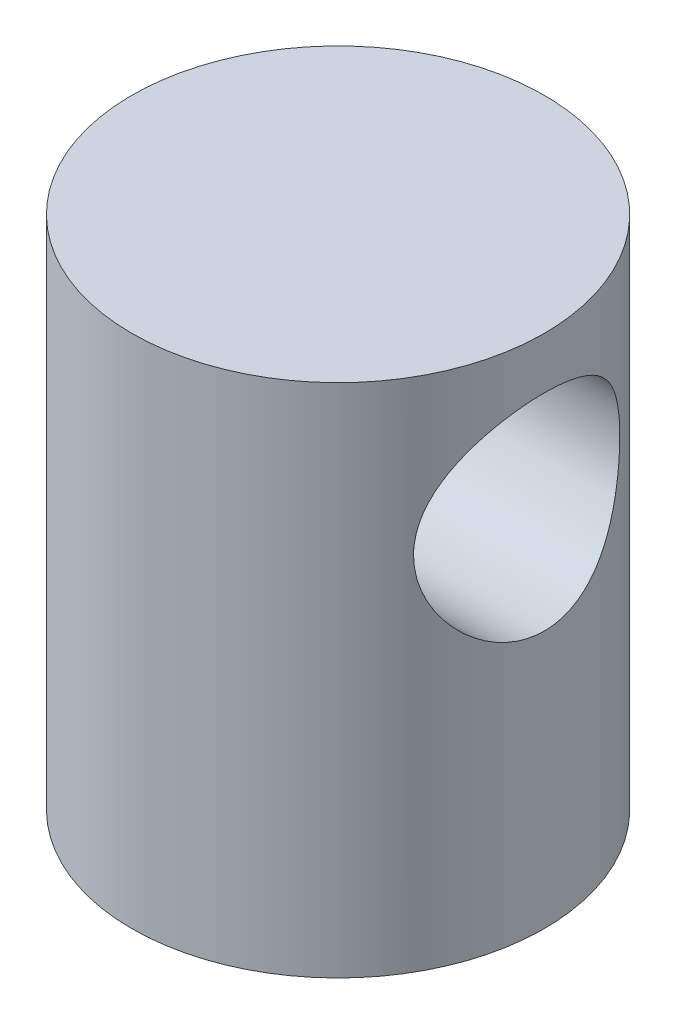
ISO-10303-21;
HEADER;
FILE_DESCRIPTION(('STEP AP214'),'2;1');
FILE_NAME('part.step','',(''),(''),'','','');
FILE_SCHEMA(('AUTOMOTIVE_DESIGN { 1 0 10303 214 1 1 1 1 }'));
ENDSEC;
DATA;
#1=APPLICATION_CONTEXT('core data for automotive mechanical design processes');
#2=APPLICATION_PROTOCOL_DEFINITION('international standard','automotive_design',2000,#1);
#3=PRODUCT_CONTEXT('',#1,'mechanical');
#4=PRODUCT('Part','Part','',(#3));
#5=PRODUCT_RELATED_PRODUCT_CATEGORY('part','',(#4));
#6=PRODUCT_DEFINITION_FORMATION('','',#4);
#7=PRODUCT_DEFINITION_CONTEXT('part definition',#1,'design');
#8=PRODUCT_DEFINITION('design','',#6,#7);
#9=PRODUCT_DEFINITION_SHAPE('','',#8);
#10=(LENGTH_UNIT() NAMED_UNIT(*) SI_UNIT(.MILLI.,.METRE.));
#11=(NAMED_UNIT(*) PLANE_ANGLE_UNIT() SI_UNIT($,.RADIAN.));
#12=(NAMED_UNIT(*) SI_UNIT($,.STERADIAN.) SOLID_ANGLE_UNIT());
#13=UNCERTAINTY_MEASURE_WITH_UNIT(LENGTH_MEASURE(1.E-05),#10,'distance_accuracy_value','');
#14=(GEOMETRIC_REPRESENTATION_CONTEXT(3) GLOBAL_UNCERTAINTY_ASSIGNED_CONTEXT((#13)) GLOBAL_UNIT_ASSIGNED_CONTEXT((#10,
#11,#12)) REPRESENTATION_CONTEXT('',''));
#15=CARTESIAN_POINT('',(0.,0.,0.));
#16=DIRECTION('',(0.,0.,1.));
#17=DIRECTION('',(1.,0.,0.));
#18=AXIS2_PLACEMENT_3D('',#15,#16,#17);
#19=CARTESIAN_POINT('',(0.,50.,0.));
#20=DIRECTION('',(0.,-1.,0.));
#21=DIRECTION('',(0.,0.,-1.));
#22=AXIS2_PLACEMENT_3D('',#19,#20,#21);
#23=CYLINDRICAL_SURFACE('',#22,20.);
#24=CARTESIAN_POINT('',(0.,50.,0.));
#25=DIRECTION('',(0.,1.,0.));
#26=DIRECTION('',(0.,0.,1.));
#27=AXIS2_PLACEMENT_3D('',#24,#25,#26);
#28=CIRCLE('',#27,20.);
#29=CARTESIAN_POINT('',(0.,50.,20.));
#30=VERTEX_POINT('',#29);
#31=EDGE_CURVE('E10',#30,#30,#28,.T.);
#32=ORIENTED_EDGE('',*,*,#31,.F.);
#33=EDGE_LOOP('',(#32));
#34=FACE_BOUND('',#33,.T.);
#35=CARTESIAN_POINT('',(0.,0.,0.));
#36=DIRECTION('',(0.,1.,0.));
#37=DIRECTION('',(0.,0.,1.));
#38=AXIS2_PLACEMENT_3D('',#35,#36,#37);
#39=CIRCLE('',#38,20.);
#40=CARTESIAN_POINT('',(0.,0.,20.));
#41=VERTEX_POINT('',#40);
#42=EDGE_CURVE('E46',#41,#41,#39,.T.);
#43=ORIENTED_EDGE('',*,*,#42,.T.);
#44=EDGE_LOOP('',(#43));
#45=FACE_BOUND('',#44,.T.);
#46=CARTESIAN_POINT('',(-17.3205080756888,35.,10.));
#47=CARTESIAN_POINT('',(-17.3205095702683,35.2606630406012,9.99999887830497));
#48=CARTESIAN_POINT('',(-17.3264124109147,35.5213487765781,9.98979463038363));
#49=CARTESIAN_POINT('',(-17.3498046872689,36.0407114771056,9.94911125215874));
#50=CARTESIAN_POINT('',(-17.3672995171185,36.2993874497232,9.91862268285217));
#51=CARTESIAN_POINT('',(-17.4132568469047,36.8130233814932,9.83771551508561));
#52=CARTESIAN_POINT('',(-17.4417365535713,37.0679768561899,9.78726564599456));
#53=CARTESIAN_POINT('',(-17.5086546907093,37.5720498819736,9.66704369384918));
#54=CARTESIAN_POINT('',(-17.5470974356035,37.821166854517,9.59726323891774));
#55=CARTESIAN_POINT('',(-17.6323996319525,38.310473680887,9.43962165537102));
#56=CARTESIAN_POINT('',(-17.6792090659448,38.5507068685627,9.3518675445998));
#57=CARTESIAN_POINT('',(-17.779982741108,39.0225542268414,9.15882440342409));
#58=CARTESIAN_POINT('',(-17.8339495753282,39.2541652345885,9.05352901444523));
#59=CARTESIAN_POINT('',(-17.9475017275461,39.7075453910155,8.82628481748803));
#60=CARTESIAN_POINT('',(-18.007085719386,39.9293168446285,8.70433993726486));
#61=CARTESIAN_POINT('',(-18.1303531605008,40.3621596673329,8.44458163828187));
#62=CARTESIAN_POINT('',(-18.1940367447196,40.5732306837951,8.30676769705149));
#63=CARTESIAN_POINT('',(-18.329363902558,41.0008375300781,8.0040071823726));
#64=CARTESIAN_POINT('',(-18.4012302839619,41.2163824929631,7.83775940314261));
#65=CARTESIAN_POINT('',(-18.5460965168945,41.6329349102144,7.48852658775189));
#66=CARTESIAN_POINT('',(-18.6190960729559,41.8339460793189,7.30554585569179));
#67=CARTESIAN_POINT('',(-18.7644955635795,42.2206945636739,6.92354675196283));
#68=CARTESIAN_POINT('',(-18.836894960655,42.4064192905492,6.72451542443151));
#69=CARTESIAN_POINT('',(-18.9792540720478,42.7613467831264,6.31154503656169));
#70=CARTESIAN_POINT('',(-19.0492146445795,42.9305553993045,6.09761130143478));
#71=CARTESIAN_POINT('',(-19.1896470662367,43.2623641319036,5.64077435798557));
#72=CARTESIAN_POINT('',(-19.2598322512756,43.4237392526275,5.39689043752675));
#73=CARTESIAN_POINT('',(-19.3935808273359,43.7252065641329,4.89454568059951));
#74=CARTESIAN_POINT('',(-19.4571438380477,43.8652975327826,4.63608400824708));
#75=CARTESIAN_POINT('',(-19.5757886087363,44.1227489251954,4.10635184715094));
#76=CARTESIAN_POINT('',(-19.6308744780683,44.240120369571,3.83508764838736));
#77=CARTESIAN_POINT('',(-19.7309453282108,44.4508629769442,3.28159286613366));
#78=CARTESIAN_POINT('',(-19.775931381843,44.5442366891792,2.99936345112904));
#79=CARTESIAN_POINT('',(-19.8516061014691,44.7000287759064,2.44661617022939));
#80=CARTESIAN_POINT('',(-19.8830841882928,44.7641767012488,2.17669338788491));
#81=CARTESIAN_POINT('',(-19.9352303438994,44.8699306679179,1.6314331616739));
#82=CARTESIAN_POINT('',(-19.9558988826763,44.9115376893153,1.35609595376428));
#83=CARTESIAN_POINT('',(-19.9858180043386,44.9716398194161,0.802434144223485));
#84=CARTESIAN_POINT('',(-19.9950744057828,44.9901467059464,0.52411113800123));
#85=CARTESIAN_POINT('',(-20.001913600906,45.003828626805,-0.0332441550447319));
#86=CARTESIAN_POINT('',(-19.9994971087928,44.9990050886089,-0.312276397429636));
#87=CARTESIAN_POINT('',(-19.9837839047877,44.9675360431058,-0.84436537815472));
#88=CARTESIAN_POINT('',(-19.9714530082902,44.9428274531738,-1.09756809880906));
#89=CARTESIAN_POINT('',(-19.9374335863625,44.8743173771142,-1.60072224441901));
#90=CARTESIAN_POINT('',(-19.9157457197429,44.8305172351925,-1.85067389700142));
#91=CARTESIAN_POINT('',(-19.8635314520899,44.724300388583,-2.34564683757823));
#92=CARTESIAN_POINT('',(-19.8330047631323,44.6618830774403,-2.59066796468298));
#93=CARTESIAN_POINT('',(-19.7638249456672,44.5190690101716,-3.0742307116896));
#94=CARTESIAN_POINT('',(-19.7251715252824,44.4386716082714,-3.3127720985195));
#95=CARTESIAN_POINT('',(-19.6400278970987,44.2594279438338,-3.78519130198348));
#96=CARTESIAN_POINT('',(-19.5934383954188,44.1603459756455,-4.01896179863547));
#97=CARTESIAN_POINT('',(-19.4938328204623,43.9453098003913,-4.47722728595916));
#98=CARTESIAN_POINT('',(-19.4408144703024,43.8293496126936,-4.70171895241328));
#99=CARTESIAN_POINT('',(-19.2738101334568,43.4574852859938,-5.35951935176704));
#100=CARTESIAN_POINT('',(-19.1518214470897,43.17748838904,-5.77743819792881));
#101=CARTESIAN_POINT('',(-18.8844067887046,42.5309599928611,-6.60185513584859));
#102=CARTESIAN_POINT('',(-18.7378553723017,42.1587504953511,-7.00353936956525));
#103=CARTESIAN_POINT('',(-18.5185765182046,41.5553615828101,-7.5565805421889));
#104=CARTESIAN_POINT('',(-18.4455210194507,41.3465480347979,-7.73279224461712));
#105=CARTESIAN_POINT('',(-18.301419633557,40.9146773262756,-8.06791510126962));
#106=CARTESIAN_POINT('',(-18.2303740512964,40.6916180214012,-8.22682364112475));
#107=CARTESIAN_POINT('',(-18.0878347411401,40.2176662830823,-8.53586780278159));
#108=CARTESIAN_POINT('',(-18.0166021936665,39.9659060892976,-8.68479491188952));
#109=CARTESIAN_POINT('',(-17.8810231107822,39.4489493278009,-8.96061518558477));
#110=CARTESIAN_POINT('',(-17.8166734823335,39.1837588749785,-9.08751826340233));
#111=CARTESIAN_POINT('',(-17.6972138879565,38.64159710084,-9.31801905264336));
#112=CARTESIAN_POINT('',(-17.6420984647868,38.3646328598231,-9.42163054141924));
#113=CARTESIAN_POINT('',(-17.5432965504952,37.8007562102672,-9.60435110537391));
#114=CARTESIAN_POINT('',(-17.4996085011007,37.5138451641551,-9.68346352159405));
#115=CARTESIAN_POINT('',(-17.4285246280669,36.9554952673323,-9.81078056042748));
#116=CARTESIAN_POINT('',(-17.400112529026,36.6846306141937,-9.86093677879992));
#117=CARTESIAN_POINT('',(-17.3557653968311,36.1386742557104,-9.93878416908063));
#118=CARTESIAN_POINT('',(-17.3398296585902,35.8635827901352,-9.96647661050595));
#119=CARTESIAN_POINT('',(-17.3211203070709,35.3117693058051,-9.99895720583312));
#120=CARTESIAN_POINT('',(-17.3183387420978,35.035048373395,-10.0037591970207));
#121=CARTESIAN_POINT('',(-17.3260388316313,34.4823571523743,-9.99041751959192));
#122=CARTESIAN_POINT('',(-17.3365195908785,34.2063868143558,-9.97227539979392));
#123=CARTESIAN_POINT('',(-17.3684286609902,33.6878300980115,-9.91658048540566));
#124=CARTESIAN_POINT('',(-17.3885290217086,33.4449043513406,-9.88137691490021));
#125=CARTESIAN_POINT('',(-17.4382137869217,32.9631581986411,-9.79342893834458));
#126=CARTESIAN_POINT('',(-17.467801331278,32.7243391793773,-9.74067872487188));
#127=CARTESIAN_POINT('',(-17.5355331166034,32.2523728066503,-9.61821012578334));
#128=CARTESIAN_POINT('',(-17.5736762155234,32.0192247007982,-9.54849400477786));
#129=CARTESIAN_POINT('',(-17.6574071681516,31.5597756536797,-9.39275103363472));
#130=CARTESIAN_POINT('',(-17.7029979734995,31.3334774694603,-9.30671771455721));
#131=CARTESIAN_POINT('',(-17.8535843814249,30.6461619123822,-9.01657018480756));
#132=CARTESIAN_POINT('',(-17.9691397733146,30.19832719446,-8.78600743614722));
#133=CARTESIAN_POINT('',(-18.2156365133527,29.3451898612097,-8.26280380655758));
#134=CARTESIAN_POINT('',(-18.3465857498225,28.93990925518,-7.97013103597559));
#135=CARTESIAN_POINT('',(-18.5540860890308,28.3445899996841,-7.46888401537909));
#136=CARTESIAN_POINT('',(-18.6294365394137,28.137806590372,-7.27935116097346));
#137=CARTESIAN_POINT('',(-18.7793184193833,27.7407576624369,-6.88345408602483));
#138=CARTESIAN_POINT('',(-18.8538500850067,27.5504872682223,-6.67709486873341));
#139=CARTESIAN_POINT('',(-19.0002370989649,27.1874055197796,-6.24838707618251));
#140=CARTESIAN_POINT('',(-19.0720904041602,27.0146073285284,-6.02602665885359));
#141=CARTESIAN_POINT('',(-19.2111944255316,26.687849993078,-5.56664786728032));
#142=CARTESIAN_POINT('',(-19.2784470951099,26.533882831183,-5.32963579644158));
#143=CARTESIAN_POINT('',(-19.4083463032874,26.2420643454996,-4.83560208582895));
#144=CARTESIAN_POINT('',(-19.4708214998861,26.1047543068911,-4.57821478300822));
#145=CARTESIAN_POINT('',(-19.5873354303861,25.8525290797491,-4.05082787591117));
#146=CARTESIAN_POINT('',(-19.6413738815295,25.7376146417731,-3.78082784931273));
#147=CARTESIAN_POINT('',(-19.7393769209225,25.5315676034334,-3.23033940661204));
#148=CARTESIAN_POINT('',(-19.7833487026856,25.4404180145035,-2.94985864767703));
#149=CARTESIAN_POINT('',(-19.8599022734451,25.2829809377614,-2.38049331567772));
#150=CARTESIAN_POINT('',(-19.8924854130529,25.2166905017637,-2.09160974353147));
#151=CARTESIAN_POINT('',(-19.9427983622959,25.1148104680745,-1.53480500342458));
#152=CARTESIAN_POINT('',(-19.9616170482062,25.0769613323232,-1.26739371229205));
#153=CARTESIAN_POINT('',(-19.9884894545243,25.0230133013929,-0.729851996988026));
#154=CARTESIAN_POINT('',(-19.9965438581379,25.0069130258193,-0.459721746484662));
#155=CARTESIAN_POINT('',(-20.0016629969108,24.996673505281,0.0809759419303042));
#156=CARTESIAN_POINT('',(-19.998731006214,25.0025277174828,0.351543225574791));
#157=CARTESIAN_POINT('',(-19.9819662987136,25.0361056712819,0.890971567979916));
#158=CARTESIAN_POINT('',(-19.9681338819984,25.0638288108282,1.15983267350619));
#159=CARTESIAN_POINT('',(-19.9312153598393,25.1382400784601,1.67605139696945));
#160=CARTESIAN_POINT('',(-19.9088004475429,25.18355535572,1.9236568390133));
#161=CARTESIAN_POINT('',(-19.8553300434365,25.292457507847,2.41384547185346));
#162=CARTESIAN_POINT('',(-19.8242750394308,25.3560433511971,2.65642894535069));
#163=CARTESIAN_POINT('',(-19.7542370428942,25.5008477412612,3.13506320784849));
#164=CARTESIAN_POINT('',(-19.7152547758225,25.5820646745216,3.3711145923855));
#165=CARTESIAN_POINT('',(-19.6302044089834,25.7614308709562,3.83546861689578));
#166=CARTESIAN_POINT('',(-19.5841335855708,25.8595866443336,4.06376823706492));
#167=CARTESIAN_POINT('',(-19.483810895842,26.0765183714271,4.52085803757348));
#168=CARTESIAN_POINT('',(-19.4292950766497,26.1959918753,4.74925902682011));
#169=CARTESIAN_POINT('',(-19.3148302804231,26.4515659425875,5.19522438508585));
#170=CARTESIAN_POINT('',(-19.2548794530109,26.587672174233,5.41278502408942));
#171=CARTESIAN_POINT('',(-19.1308402275846,26.875596729667,5.83606045705828));
#172=CARTESIAN_POINT('',(-19.0667510038749,27.0274181926352,6.04177287147124));
#173=CARTESIAN_POINT('',(-18.9358010862794,27.3458750089434,6.44045588132559));
#174=CARTESIAN_POINT('',(-18.8689402387161,27.5125111842997,6.63342576869236));
#175=CARTESIAN_POINT('',(-18.7271146644604,27.8770952740716,7.02443076725262));
#176=CARTESIAN_POINT('',(-18.6520069761602,28.0765084457605,7.22105023736916));
#177=CARTESIAN_POINT('',(-18.5021161963615,28.4911102045628,7.59688252262079));
#178=CARTESIAN_POINT('',(-18.4273330205942,28.7062943999369,7.77610015155212));
#179=CARTESIAN_POINT('',(-18.2800108882226,29.1516671852508,8.11637930260119));
#180=CARTESIAN_POINT('',(-18.2074742403954,29.3818705021355,8.27742256848714));
#181=CARTESIAN_POINT('',(-18.0668000353187,29.8560212367289,8.58012843326387));
#182=CARTESIAN_POINT('',(-17.9986630979644,30.0999705821503,8.72178830427269));
#183=CARTESIAN_POINT('',(-17.8668466988412,30.6083744920202,8.98880823408349));
#184=CARTESIAN_POINT('',(-17.8033795439981,30.8732353613213,9.11350193984134));
#185=CARTESIAN_POINT('',(-17.6857538350981,31.414528385021,9.33972032642159));
#186=CARTESIAN_POINT('',(-17.6315904873914,31.6909544887475,9.44125694748286));
#187=CARTESIAN_POINT('',(-17.5348420080576,32.2528111140001,9.61975104079584));
#188=CARTESIAN_POINT('',(-17.4922271352712,32.5382163517558,9.69677174083926));
#189=CARTESIAN_POINT('',(-17.420295302782,33.1161855224912,9.82541504864774));
#190=CARTESIAN_POINT('',(-17.3909690467734,33.4087442995982,9.87705541385781));
#191=CARTESIAN_POINT('',(-17.3529508814928,33.9179955523824,9.94364603197745));
#192=CARTESIAN_POINT('',(-17.340814385915,34.1336483202961,9.96475859003795));
#193=CARTESIAN_POINT('',(-17.3245920918704,34.5661954321292,9.99293651062053));
#194=CARTESIAN_POINT('',(-17.3205068319779,34.783089858134,10.0000009334159));
#195=CARTESIAN_POINT('',(-17.3205080756888,35.,10.));
#196=B_SPLINE_CURVE_WITH_KNOTS('',3,(#46,#47,#48,#49,#50,#51,#52,#53,#54,#55,#56,#57,#58,#59,
#60,#61,#62,#63,#64,#65,#66,#67,#68,#69,#70,#71,#72,#73,#74,#75,#76,#77,#78,#79,#80,#81,#82,#83,
#84,#85,#86,#87,#88,#89,#90,#91,#92,#93,#94,#95,#96,#97,#98,#99,#100,#101,#102,#103,#104,#105,
#106,#107,#108,#109,#110,#111,#112,#113,#114,#115,#116,#117,#118,#119,#120,#121,#122,#123,#124,
#125,#126,#127,#128,#129,#130,#131,#132,#133,#134,#135,#136,#137,#138,#139,#140,#141,#142,#143,
#144,#145,#146,#147,#148,#149,#150,#151,#152,#153,#154,#155,#156,#157,#158,#159,#160,#161,#162,
#163,#164,#165,#166,#167,#168,#169,#170,#171,#172,#173,#174,#175,#176,#177,#178,#179,#180,#181,
#182,#183,#184,#185,#186,#187,#188,#189,#190,#191,#192,#193,#194,#195),.UNSPECIFIED.,.T.,.F.,(4,
2,2,2,2,2,2,2,2,2,2,2,2,2,2,2,2,2,2,2,2,2,2,2,2,2,2,2,2,2,2,2,2,2,2,2,2,2,2,2,2,2,2,2,2,2,2,2,2,
2,2,2,2,2,2,2,2,2,2,2,2,2,2,2,2,2,2,2,2,2,2,2,2,2,4),(0.,0.781764769112963,1.56389357534752,
2.34725251774208,3.13095125664016,3.91011273597292,4.68955727220399,5.46881824759953,
6.24810488660504,7.09181817840652,7.93531505492037,8.77949974187697,9.62338430104276,
10.5244589431129,11.4255853051682,12.3262734543219,13.2268658853578,14.063393070516,
14.8998838808356,15.735948023788,16.571961012676,17.3351709001918,18.0983270599865,
18.8615080823398,19.6247165195584,20.3982891735806,21.1721366058307,22.7189130677432,
24.411902278383,25.2596540794493,26.1075337917995,27.0095657903684,27.9111907165882,
28.8122809054192,29.7132481546281,30.542861630924,31.3724282192078,32.2014932705296,
33.0305023596627,33.7685142503992,34.5067706447975,35.244928550686,35.9833797127091,
37.5272041097116,39.0718230911075,39.9423348698488,40.8125887427685,41.6834934262,
42.5540260036818,43.4478458060077,44.3416955583132,45.2349045692787,46.1280076160787,
46.9391312005144,47.7502033007272,48.5610337060351,49.371841789984,50.1291222204446,
50.8863599048713,51.6435283222654,52.4009883973669,53.190547229172,53.980375887315,
54.7703626224474,55.5603932185549,56.4292490887194,57.2978639221841,58.1673436596754,
59.0369456360201,59.934364567853,60.8313197217513,61.7259424792672,62.6199384164504,
63.27043863481,63.9209823658393),.UNSPECIFIED.);
#197=CARTESIAN_POINT('',(-17.3205080756888,35.,10.));
#198=VERTEX_POINT('',#197);
#199=EDGE_CURVE('E52',#198,#198,#196,.T.);
#200=ORIENTED_EDGE('',*,*,#199,.F.);
#201=EDGE_LOOP('',(#200));
#202=FACE_BOUND('',#201,.T.);
#203=CARTESIAN_POINT('',(17.3205080756888,35.,10.));
#204=CARTESIAN_POINT('',(17.3205095702683,34.7393369593989,9.99999887830497));
#205=CARTESIAN_POINT('',(17.3264124109147,34.4786512234219,9.98979463038363));
#206=CARTESIAN_POINT('',(17.3498046872689,33.9592885228944,9.94911125215874));
#207=CARTESIAN_POINT('',(17.3672995171185,33.7006125502768,9.91862268285217));
#208=CARTESIAN_POINT('',(17.4132568469047,33.1869766185068,9.83771551508561));
#209=CARTESIAN_POINT('',(17.4417365535713,32.9320231438101,9.78726564599456));
#210=CARTESIAN_POINT('',(17.5086546907093,32.4279501180264,9.66704369384918));
#211=CARTESIAN_POINT('',(17.5470974356035,32.178833145483,9.59726323891774));
#212=CARTESIAN_POINT('',(17.6323996319525,31.689526319113,9.43962165537102));
#213=CARTESIAN_POINT('',(17.6792090659448,31.4492931314373,9.3518675445998));
#214=CARTESIAN_POINT('',(17.779982741108,30.9774457731586,9.15882440342408));
#215=CARTESIAN_POINT('',(17.8339495753282,30.7458347654115,9.05352901444523));
#216=CARTESIAN_POINT('',(17.9475017275461,30.2924546089845,8.82628481748803));
#217=CARTESIAN_POINT('',(18.007085719386,30.0706831553715,8.70433993726486));
#218=CARTESIAN_POINT('',(18.1303531605008,29.6378403326671,8.44458163828187));
#219=CARTESIAN_POINT('',(18.1940367447196,29.4267693162049,8.30676769705149));
#220=CARTESIAN_POINT('',(18.329363902558,28.999162469922,8.00400718237261));
#221=CARTESIAN_POINT('',(18.4012302839619,28.783617507037,7.83775940314261));
#222=CARTESIAN_POINT('',(18.5460965168945,28.3670650897856,7.4885265877519));
#223=CARTESIAN_POINT('',(18.6190960729559,28.1660539206811,7.30554585569179));
#224=CARTESIAN_POINT('',(18.7644955635795,27.7793054363261,6.92354675196283));
#225=CARTESIAN_POINT('',(18.836894960655,27.5935807094508,6.72451542443151));
#226=CARTESIAN_POINT('',(18.9792540720478,27.2386532168736,6.31154503656169));
#227=CARTESIAN_POINT('',(19.0492146445795,27.0694446006956,6.09761130143478));
#228=CARTESIAN_POINT('',(19.1896470662367,26.7376358680964,5.64077435798557));
#229=CARTESIAN_POINT('',(19.2598322512756,26.5762607473725,5.39689043752675));
#230=CARTESIAN_POINT('',(19.3935808273359,26.2747934358672,4.89454568059951));
#231=CARTESIAN_POINT('',(19.4571438380477,26.1347024672174,4.63608400824709));
#232=CARTESIAN_POINT('',(19.5757886087363,25.8772510748047,4.10635184715094));
#233=CARTESIAN_POINT('',(19.6308744780683,25.759879630429,3.83508764838736));
#234=CARTESIAN_POINT('',(19.7309453282108,25.5491370230558,3.28159286613366));
#235=CARTESIAN_POINT('',(19.775931381843,25.4557633108209,2.99936345112905));
#236=CARTESIAN_POINT('',(19.8516061014691,25.2999712240936,2.44661617022939));
#237=CARTESIAN_POINT('',(19.8830841882928,25.2358232987512,2.17669338788491));
#238=CARTESIAN_POINT('',(19.9352303438994,25.1300693320821,1.6314331616739));
#239=CARTESIAN_POINT('',(19.9558988826763,25.0884623106847,1.35609595376428));
#240=CARTESIAN_POINT('',(19.9858180043386,25.0283601805839,0.802434144223485));
#241=CARTESIAN_POINT('',(19.9950744057828,25.0098532940536,0.524111138001229));
#242=CARTESIAN_POINT('',(20.001913600906,24.996171373195,-0.0332441550447331));
#243=CARTESIAN_POINT('',(19.9994971087928,25.0009949113911,-0.312276397429637));
#244=CARTESIAN_POINT('',(19.9837839047877,25.0324639568942,-0.84436537815472));
#245=CARTESIAN_POINT('',(19.9714530082902,25.0571725468262,-1.09756809880906));
#246=CARTESIAN_POINT('',(19.9374335863625,25.1256826228858,-1.60072224441901));
#247=CARTESIAN_POINT('',(19.9157457197429,25.1694827648075,-1.85067389700142));
#248=CARTESIAN_POINT('',(19.8635314520899,25.275699611417,-2.34564683757824));
#249=CARTESIAN_POINT('',(19.8330047631323,25.3381169225597,-2.59066796468298));
#250=CARTESIAN_POINT('',(19.7638249456672,25.4809309898285,-3.0742307116896));
#251=CARTESIAN_POINT('',(19.7251715252824,25.5613283917286,-3.3127720985195));
#252=CARTESIAN_POINT('',(19.6400278970987,25.7405720561662,-3.78519130198348));
#253=CARTESIAN_POINT('',(19.5934383954188,25.8396540243545,-4.01896179863547));
#254=CARTESIAN_POINT('',(19.4938328204623,26.0546901996087,-4.47722728595916));
#255=CARTESIAN_POINT('',(19.4408144703024,26.1706503873064,-4.70171895241328));
#256=CARTESIAN_POINT('',(19.2738101334568,26.5425147140062,-5.35951935176704));
#257=CARTESIAN_POINT('',(19.1518214470897,26.82251161096,-5.77743819792881));
#258=CARTESIAN_POINT('',(18.8844067887046,27.4690400071389,-6.6018551358486));
#259=CARTESIAN_POINT('',(18.7378553723017,27.8412495046489,-7.00353936956525));
#260=CARTESIAN_POINT('',(18.5185765182046,28.4446384171899,-7.5565805421889));
#261=CARTESIAN_POINT('',(18.4455210194507,28.6534519652021,-7.73279224461712));
#262=CARTESIAN_POINT('',(18.301419633557,29.0853226737244,-8.06791510126962));
#263=CARTESIAN_POINT('',(18.2303740512964,29.3083819785988,-8.22682364112475));
#264=CARTESIAN_POINT('',(18.0878347411401,29.7823337169177,-8.53586780278159));
#265=CARTESIAN_POINT('',(18.0166021936665,30.0340939107024,-8.68479491188952));
#266=CARTESIAN_POINT('',(17.8810231107822,30.5510506721991,-8.96061518558476));
#267=CARTESIAN_POINT('',(17.8166734823335,30.8162411250215,-9.08751826340232));
#268=CARTESIAN_POINT('',(17.6972138879565,31.35840289916,-9.31801905264336));
#269=CARTESIAN_POINT('',(17.6420984647868,31.6353671401769,-9.42163054141923));
#270=CARTESIAN_POINT('',(17.5432965504952,32.1992437897328,-9.6043511053739));
#271=CARTESIAN_POINT('',(17.4996085011007,32.4861548358449,-9.68346352159404));
#272=CARTESIAN_POINT('',(17.4285246280669,33.0445047326677,-9.81078056042748));
#273=CARTESIAN_POINT('',(17.400112529026,33.3153693858064,-9.86093677879992));
#274=CARTESIAN_POINT('',(17.3557653968311,33.8613257442896,-9.93878416908063));
#275=CARTESIAN_POINT('',(17.3398296585902,34.1364172098648,-9.96647661050596));
#276=CARTESIAN_POINT('',(17.3211203070709,34.6882306941949,-9.99895720583312));
#277=CARTESIAN_POINT('',(17.3183387420978,34.9649516266051,-10.0037591970207));
#278=CARTESIAN_POINT('',(17.3260388316313,35.5176428476258,-9.99041751959192));
#279=CARTESIAN_POINT('',(17.3365195908785,35.7936131856442,-9.97227539979392));
#280=CARTESIAN_POINT('',(17.3684286609902,36.3121699019885,-9.91658048540566));
#281=CARTESIAN_POINT('',(17.3885290217086,36.5550956486594,-9.88137691490021));
#282=CARTESIAN_POINT('',(17.4382137869217,37.0368418013589,-9.79342893834458));
#283=CARTESIAN_POINT('',(17.467801331278,37.2756608206227,-9.74067872487188));
#284=CARTESIAN_POINT('',(17.5355331166034,37.7476271933497,-9.61821012578334));
#285=CARTESIAN_POINT('',(17.5736762155234,37.9807752992018,-9.54849400477786));
#286=CARTESIAN_POINT('',(17.6574071681516,38.4402243463203,-9.39275103363472));
#287=CARTESIAN_POINT('',(17.7029979734995,38.6665225305397,-9.30671771455722));
#288=CARTESIAN_POINT('',(17.8535843814249,39.3538380876178,-9.01657018480757));
#289=CARTESIAN_POINT('',(17.9691397733146,39.80167280554,-8.78600743614722));
#290=CARTESIAN_POINT('',(18.2156365133527,40.6548101387903,-8.26280380655758));
#291=CARTESIAN_POINT('',(18.3465857498225,41.06009074482,-7.97013103597559));
#292=CARTESIAN_POINT('',(18.5540860890308,41.6554100003159,-7.46888401537909));
#293=CARTESIAN_POINT('',(18.6294365394137,41.862193409628,-7.27935116097346));
#294=CARTESIAN_POINT('',(18.7793184193833,42.2592423375631,-6.88345408602483));
#295=CARTESIAN_POINT('',(18.8538500850067,42.4495127317777,-6.67709486873341));
#296=CARTESIAN_POINT('',(19.0002370989649,42.8125944802204,-6.24838707618251));
#297=CARTESIAN_POINT('',(19.0720904041602,42.9853926714716,-6.02602665885359));
#298=CARTESIAN_POINT('',(19.2111944255316,43.312150006922,-5.56664786728031));
#299=CARTESIAN_POINT('',(19.2784470951099,43.466117168817,-5.32963579644157));
#300=CARTESIAN_POINT('',(19.4083463032874,43.7579356545004,-4.83560208582895));
#301=CARTESIAN_POINT('',(19.4708214998861,43.8952456931089,-4.57821478300822));
#302=CARTESIAN_POINT('',(19.5873354303861,44.1474709202509,-4.05082787591116));
#303=CARTESIAN_POINT('',(19.6413738815295,44.2623853582269,-3.78082784931273));
#304=CARTESIAN_POINT('',(19.7393769209225,44.4684323965666,-3.23033940661203));
#305=CARTESIAN_POINT('',(19.7833487026856,44.5595819854966,-2.94985864767703));
#306=CARTESIAN_POINT('',(19.8599022734451,44.7170190622386,-2.38049331567771));
#307=CARTESIAN_POINT('',(19.8924854130529,44.7833094982363,-2.09160974353147));
#308=CARTESIAN_POINT('',(19.9427983622959,44.8851895319255,-1.53480500342459));
#309=CARTESIAN_POINT('',(19.9616170482062,44.9230386676768,-1.26739371229205));
#310=CARTESIAN_POINT('',(19.9884894545243,44.9769866986071,-0.72985199698803));
#311=CARTESIAN_POINT('',(19.9965438581379,44.9930869741807,-0.459721746484666));
#312=CARTESIAN_POINT('',(20.0016629969108,45.003326494719,0.0809759419302984));
#313=CARTESIAN_POINT('',(19.998731006214,44.9974722825172,0.351543225574782));
#314=CARTESIAN_POINT('',(19.9819662987136,44.9638943287181,0.890971567979908));
#315=CARTESIAN_POINT('',(19.9681338819984,44.9361711891718,1.15983267350618));
#316=CARTESIAN_POINT('',(19.9312153598393,44.8617599215399,1.67605139696944));
#317=CARTESIAN_POINT('',(19.9088004475429,44.81644464428,1.9236568390133));
#318=CARTESIAN_POINT('',(19.8553300434365,44.707542492153,2.41384547185346));
#319=CARTESIAN_POINT('',(19.8242750394308,44.6439566488029,2.65642894535069));
#320=CARTESIAN_POINT('',(19.7542370428942,44.4991522587388,3.13506320784848));
#321=CARTESIAN_POINT('',(19.7152547758225,44.4179353254784,3.3711145923855));
#322=CARTESIAN_POINT('',(19.6302044089834,44.2385691290438,3.83546861689578));
#323=CARTESIAN_POINT('',(19.5841335855708,44.1404133556664,4.06376823706492));
#324=CARTESIAN_POINT('',(19.483810895842,43.9234816285729,4.52085803757348));
#325=CARTESIAN_POINT('',(19.4292950766497,43.8040081247,4.74925902682011));
#326=CARTESIAN_POINT('',(19.3148302804231,43.5484340574125,5.19522438508584));
#327=CARTESIAN_POINT('',(19.2548794530109,43.412327825767,5.41278502408941));
#328=CARTESIAN_POINT('',(19.1308402275846,43.1244032703331,5.83606045705828));
#329=CARTESIAN_POINT('',(19.0667510038749,42.9725818073649,6.04177287147123));
#330=CARTESIAN_POINT('',(18.9358010862794,42.6541249910566,6.44045588132559));
#331=CARTESIAN_POINT('',(18.8689402387161,42.4874888157003,6.63342576869236));
#332=CARTESIAN_POINT('',(18.7271146644604,42.1229047259284,7.02443076725262));
#333=CARTESIAN_POINT('',(18.6520069761602,41.9234915542395,7.22105023736916));
#334=CARTESIAN_POINT('',(18.5021161963615,41.5088897954372,7.59688252262079));
#335=CARTESIAN_POINT('',(18.4273330205942,41.2937056000631,7.77610015155212));
#336=CARTESIAN_POINT('',(18.2800108882226,40.8483328147492,8.11637930260119));
#337=CARTESIAN_POINT('',(18.2074742403954,40.6181294978645,8.27742256848714));
#338=CARTESIAN_POINT('',(18.0668000353187,40.1439787632711,8.58012843326388));
#339=CARTESIAN_POINT('',(17.9986630979644,39.9000294178497,8.72178830427269));
#340=CARTESIAN_POINT('',(17.8668466988412,39.3916255079798,8.98880823408349));
#341=CARTESIAN_POINT('',(17.8033795439981,39.1267646386787,9.11350193984134));
#342=CARTESIAN_POINT('',(17.6857538350981,38.585471614979,9.33972032642158));
#343=CARTESIAN_POINT('',(17.6315904873914,38.3090455112525,9.44125694748286));
#344=CARTESIAN_POINT('',(17.5348420080576,37.7471888859999,9.61975104079584));
#345=CARTESIAN_POINT('',(17.4922271352712,37.4617836482442,9.69677174083926));
#346=CARTESIAN_POINT('',(17.420295302782,36.8838144775088,9.82541504864774));
#347=CARTESIAN_POINT('',(17.3909690467734,36.5912557004018,9.87705541385781));
#348=CARTESIAN_POINT('',(17.3529508814928,36.0820044476176,9.94364603197745));
#349=CARTESIAN_POINT('',(17.340814385915,35.866351679704,9.96475859003795));
#350=CARTESIAN_POINT('',(17.3245920918704,35.4338045678709,9.99293651062053));
#351=CARTESIAN_POINT('',(17.3205068319779,35.216910141866,10.0000009334159));
#352=CARTESIAN_POINT('',(17.3205080756888,35.,10.));
#353=B_SPLINE_CURVE_WITH_KNOTS('',3,(#203,#204,#205,#206,#207,#208,#209,#210,#211,#212,#213,
#214,#215,#216,#217,#218,#219,#220,#221,#222,#223,#224,#225,#226,#227,#228,#229,#230,#231,#232,
#233,#234,#235,#236,#237,#238,#239,#240,#241,#242,#243,#244,#245,#246,#247,#248,#249,#250,#251,
#252,#253,#254,#255,#256,#257,#258,#259,#260,#261,#262,#263,#264,#265,#266,#267,#268,#269,#270,
#271,#272,#273,#274,#275,#276,#277,#278,#279,#280,#281,#282,#283,#284,#285,#286,#287,#288,#289,
#290,#291,#292,#293,#294,#295,#296,#297,#298,#299,#300,#301,#302,#303,#304,#305,#306,#307,#308,
#309,#310,#311,#312,#313,#314,#315,#316,#317,#318,#319,#320,#321,#322,#323,#324,#325,#326,#327,
#328,#329,#330,#331,#332,#333,#334,#335,#336,#337,#338,#339,#340,#341,#342,#343,#344,#345,#346,
#347,#348,#349,#350,#351,#352),.UNSPECIFIED.,.T.,.F.,(4,2,2,2,2,2,2,2,2,2,2,2,2,2,2,2,2,2,2,2,2,
2,2,2,2,2,2,2,2,2,2,2,2,2,2,2,2,2,2,2,2,2,2,2,2,2,2,2,2,2,2,2,2,2,2,2,2,2,2,2,2,2,2,2,2,2,2,2,2,
2,2,2,2,2,4),(0.,0.781764769112963,1.56389357534752,2.34725251774208,3.13095125664016,
3.91011273597293,4.68955727220399,5.46881824759952,6.24810488660504,7.09181817840652,
7.93531505492037,8.77949974187697,9.62338430104276,10.5244589431129,11.4255853051681,
12.3262734543219,13.2268658853578,14.0633930705159,14.8998838808356,15.735948023788,
16.571961012676,17.3351709001918,18.0983270599865,18.8615080823398,19.6247165195584,
20.3982891735806,21.1721366058307,22.7189130677432,24.411902278383,25.2596540794493,
26.1075337917995,27.0095657903684,27.9111907165881,28.8122809054192,29.7132481546281,
30.542861630924,31.3724282192078,32.2014932705296,33.0305023596626,33.7685142503992,
34.5067706447975,35.244928550686,35.9833797127091,37.5272041097116,39.0718230911075,
39.9423348698488,40.8125887427685,41.6834934262,42.5540260036818,43.4478458060077,
44.3416955583132,45.2349045692787,46.1280076160787,46.9391312005144,47.7502033007272,
48.5610337060351,49.371841789984,50.1291222204446,50.8863599048713,51.6435283222654,
52.4009883973669,53.1905472291719,53.980375887315,54.7703626224473,55.5603932185549,
56.4292490887194,57.297863922184,58.1673436596754,59.0369456360201,59.9343645678529,
60.8313197217513,61.7259424792672,62.6199384164504,63.27043863481,63.9209823658393),.UNSPECIFIED.);
#354=CARTESIAN_POINT('',(17.3205080756888,35.,10.));
#355=VERTEX_POINT('',#354);
#356=EDGE_CURVE('E38',#355,#355,#353,.T.);
#357=ORIENTED_EDGE('',*,*,#356,.F.);
#358=EDGE_LOOP('',(#357));
#359=FACE_BOUND('',#358,.T.);
#360=ADVANCED_FACE('F34',(#34,#45,#202,#359),#23,.T.);
#361=CARTESIAN_POINT('',(0.,50.,0.));
#362=DIRECTION('',(0.,1.,0.));
#363=DIRECTION('',(0.,0.,1.));
#364=AXIS2_PLACEMENT_3D('',#361,#362,#363);
#365=PLANE('',#364);
#366=ORIENTED_EDGE('',*,*,#31,.T.);
#367=EDGE_LOOP('',(#366));
#368=FACE_BOUND('',#367,.T.);
#369=ADVANCED_FACE('F63',(#368),#365,.T.);
#370=CARTESIAN_POINT('',(0.,0.,0.));
#371=DIRECTION('',(0.,1.,0.));
#372=DIRECTION('',(0.,0.,1.));
#373=AXIS2_PLACEMENT_3D('',#370,#371,#372);
#374=PLANE('',#373);
#375=ORIENTED_EDGE('',*,*,#42,.F.);
#376=EDGE_LOOP('',(#375));
#377=FACE_BOUND('',#376,.T.);
#378=ADVANCED_FACE('F61',(#377),#374,.F.);
#379=CARTESIAN_POINT('',(50.,35.,0.));
#380=DIRECTION('',(-1.,0.,0.));
#381=DIRECTION('',(0.,0.,1.));
#382=AXIS2_PLACEMENT_3D('',#379,#380,#381);
#383=CYLINDRICAL_SURFACE('',#382,10.);
#384=ORIENTED_EDGE('',*,*,#199,.T.);
#385=EDGE_LOOP('',(#384));
#386=FACE_BOUND('',#385,.T.);
#387=ORIENTED_EDGE('',*,*,#356,.T.);
#388=EDGE_LOOP('',(#387));
#389=FACE_BOUND('',#388,.T.);
#390=ADVANCED_FACE('F57',(#386,#389),#383,.F.);
#391=CLOSED_SHELL('',(#360,#369,#378,#390));
#392=MANIFOLD_SOLID_BREP('B2',#391);
#393=ADVANCED_BREP_SHAPE_REPRESENTATION('',(#18,#392),#14);
#394=SHAPE_DEFINITION_REPRESENTATION(#9,#393);
ENDSEC;
END-ISO-10303-21;
